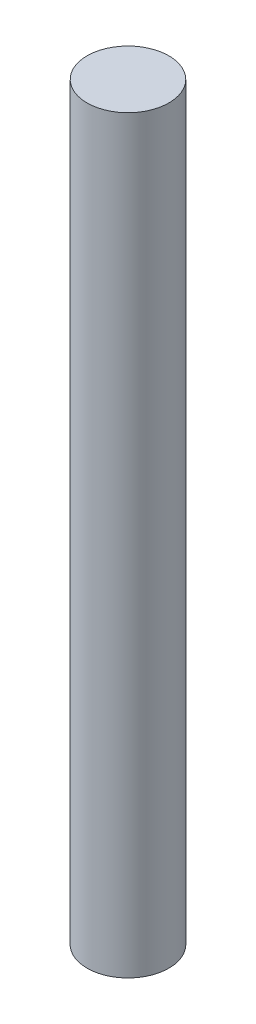
ISO-10303-21;
HEADER;
FILE_DESCRIPTION(('STEP AP214'),'2;1');
FILE_NAME('part.step','',(''),(''),'','','');
FILE_SCHEMA(('AUTOMOTIVE_DESIGN { 1 0 10303 214 1 1 1 1 }'));
ENDSEC;
DATA;
#1=APPLICATION_CONTEXT('core data for automotive mechanical design processes');
#2=APPLICATION_PROTOCOL_DEFINITION('international standard','automotive_design',2000,#1);
#3=PRODUCT_CONTEXT('',#1,'mechanical');
#4=PRODUCT('Part','Part','',(#3));
#5=PRODUCT_RELATED_PRODUCT_CATEGORY('part','',(#4));
#6=PRODUCT_DEFINITION_FORMATION('','',#4);
#7=PRODUCT_DEFINITION_CONTEXT('part definition',#1,'design');
#8=PRODUCT_DEFINITION('design','',#6,#7);
#9=PRODUCT_DEFINITION_SHAPE('','',#8);
#10=(LENGTH_UNIT() NAMED_UNIT(*) SI_UNIT(.MILLI.,.METRE.));
#11=(NAMED_UNIT(*) PLANE_ANGLE_UNIT() SI_UNIT($,.RADIAN.));
#12=(NAMED_UNIT(*) SI_UNIT($,.STERADIAN.) SOLID_ANGLE_UNIT());
#13=UNCERTAINTY_MEASURE_WITH_UNIT(LENGTH_MEASURE(1.E-05),#10,'distance_accuracy_value','');
#14=(GEOMETRIC_REPRESENTATION_CONTEXT(3) GLOBAL_UNCERTAINTY_ASSIGNED_CONTEXT((#13)) GLOBAL_UNIT_ASSIGNED_CONTEXT((#10,
#11,#12)) REPRESENTATION_CONTEXT('',''));
#15=CARTESIAN_POINT('',(0.,0.,0.));
#16=DIRECTION('',(0.,0.,1.));
#17=DIRECTION('',(1.,0.,0.));
#18=AXIS2_PLACEMENT_3D('',#15,#16,#17);
#19=CARTESIAN_POINT('',(0.,55.,0.));
#20=DIRECTION('',(0.,-1.,0.));
#21=DIRECTION('',(0.,0.,-1.));
#22=AXIS2_PLACEMENT_3D('',#19,#20,#21);
#23=CYLINDRICAL_SURFACE('',#22,3.);
#24=CARTESIAN_POINT('',(0.,55.,0.));
#25=DIRECTION('',(0.,1.,0.));
#26=DIRECTION('',(0.,0.,1.));
#27=AXIS2_PLACEMENT_3D('',#24,#25,#26);
#28=CIRCLE('',#27,3.);
#29=CARTESIAN_POINT('',(0.,55.,3.));
#30=VERTEX_POINT('',#29);
#31=EDGE_CURVE('E10',#30,#30,#28,.T.);
#32=ORIENTED_EDGE('',*,*,#31,.F.);
#33=EDGE_LOOP('',(#32));
#34=FACE_BOUND('',#33,.T.);
#35=CARTESIAN_POINT('',(0.,0.,0.));
#36=DIRECTION('',(0.,1.,0.));
#37=DIRECTION('',(0.,0.,1.));
#38=AXIS2_PLACEMENT_3D('',#35,#36,#37);
#39=CIRCLE('',#38,3.);
#40=CARTESIAN_POINT('',(0.,0.,3.));
#41=VERTEX_POINT('',#40);
#42=EDGE_CURVE('E34',#41,#41,#39,.T.);
#43=ORIENTED_EDGE('',*,*,#42,.T.);
#44=EDGE_LOOP('',(#43));
#45=FACE_BOUND('',#44,.T.);
#46=ADVANCED_FACE('F31',(#34,#45),#23,.T.);
#47=CARTESIAN_POINT('',(0.,55.,0.));
#48=DIRECTION('',(0.,1.,0.));
#49=DIRECTION('',(0.,0.,1.));
#50=AXIS2_PLACEMENT_3D('',#47,#48,#49);
#51=PLANE('',#50);
#52=ORIENTED_EDGE('',*,*,#31,.T.);
#53=EDGE_LOOP('',(#52));
#54=FACE_BOUND('',#53,.T.);
#55=ADVANCED_FACE('F46',(#54),#51,.T.);
#56=CARTESIAN_POINT('',(0.,0.,0.));
#57=DIRECTION('',(0.,1.,0.));
#58=DIRECTION('',(0.,0.,1.));
#59=AXIS2_PLACEMENT_3D('',#56,#57,#58);
#60=PLANE('',#59);
#61=ORIENTED_EDGE('',*,*,#42,.F.);
#62=EDGE_LOOP('',(#61));
#63=FACE_BOUND('',#62,.T.);
#64=ADVANCED_FACE('F44',(#63),#60,.F.);
#65=CLOSED_SHELL('',(#46,#55,#64));
#66=MANIFOLD_SOLID_BREP('B2',#65);
#67=ADVANCED_BREP_SHAPE_REPRESENTATION('',(#18,#66),#14);
#68=SHAPE_DEFINITION_REPRESENTATION(#9,#67);
ENDSEC;
END-ISO-10303-21;
